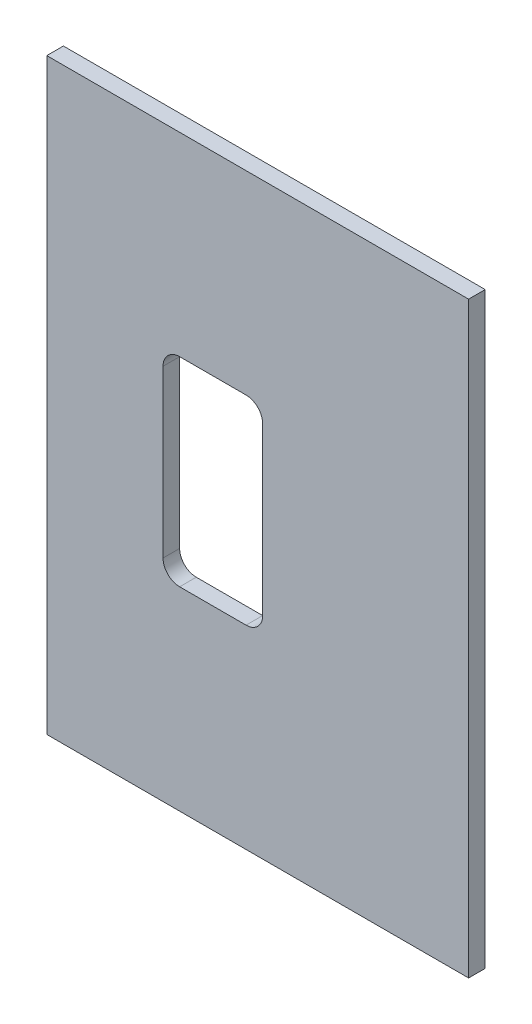
ISO-10303-21;
HEADER;
FILE_DESCRIPTION(('STEP AP214'),'2;1');
FILE_NAME('part.step','',(''),(''),'','','');
FILE_SCHEMA(('AUTOMOTIVE_DESIGN { 1 0 10303 214 1 1 1 1 }'));
ENDSEC;
DATA;
#1=APPLICATION_CONTEXT('core data for automotive mechanical design processes');
#2=APPLICATION_PROTOCOL_DEFINITION('international standard','automotive_design',2000,#1);
#3=PRODUCT_CONTEXT('',#1,'mechanical');
#4=PRODUCT('Part','Part','',(#3));
#5=PRODUCT_RELATED_PRODUCT_CATEGORY('part','',(#4));
#6=PRODUCT_DEFINITION_FORMATION('','',#4);
#7=PRODUCT_DEFINITION_CONTEXT('part definition',#1,'design');
#8=PRODUCT_DEFINITION('design','',#6,#7);
#9=PRODUCT_DEFINITION_SHAPE('','',#8);
#10=(LENGTH_UNIT() NAMED_UNIT(*) SI_UNIT(.MILLI.,.METRE.));
#11=(NAMED_UNIT(*) PLANE_ANGLE_UNIT() SI_UNIT($,.RADIAN.));
#12=(NAMED_UNIT(*) SI_UNIT($,.STERADIAN.) SOLID_ANGLE_UNIT());
#13=UNCERTAINTY_MEASURE_WITH_UNIT(LENGTH_MEASURE(1.E-05),#10,'distance_accuracy_value','');
#14=(GEOMETRIC_REPRESENTATION_CONTEXT(3) GLOBAL_UNCERTAINTY_ASSIGNED_CONTEXT((#13)) GLOBAL_UNIT_ASSIGNED_CONTEXT((#10,
#11,#12)) REPRESENTATION_CONTEXT('',''));
#15=CARTESIAN_POINT('',(0.,0.,0.));
#16=DIRECTION('',(0.,0.,1.));
#17=DIRECTION('',(1.,0.,0.));
#18=AXIS2_PLACEMENT_3D('',#15,#16,#17);
#19=CARTESIAN_POINT('',(40.3225,56.1975,3.175));
#20=DIRECTION('',(0.,0.,-1.));
#21=DIRECTION('',(-1.,0.,0.));
#22=AXIS2_PLACEMENT_3D('',#19,#20,#21);
#23=PLANE('',#22);
#24=DIRECTION('',(0.,1.,0.));
#25=VECTOR('',#24,1.);
#26=CARTESIAN_POINT('',(40.3225,-56.1975,3.175));
#27=LINE('',#26,#25);
#28=CARTESIAN_POINT('',(40.3225,-56.1975,3.175));
#29=VERTEX_POINT('',#28);
#30=CARTESIAN_POINT('',(40.3225,56.1975,3.175));
#31=VERTEX_POINT('',#30);
#32=EDGE_CURVE('E133',#29,#31,#27,.T.);
#33=ORIENTED_EDGE('',*,*,#32,.T.);
#34=DIRECTION('',(-1.,0.,0.));
#35=VECTOR('',#34,1.);
#36=CARTESIAN_POINT('',(-40.3225,56.1975,3.175));
#37=LINE('',#36,#35);
#38=CARTESIAN_POINT('',(-40.3225,56.1975,3.175));
#39=VERTEX_POINT('',#38);
#40=EDGE_CURVE('E122',#31,#39,#37,.T.);
#41=ORIENTED_EDGE('',*,*,#40,.T.);
#42=DIRECTION('',(0.,-1.,0.));
#43=VECTOR('',#42,1.);
#44=CARTESIAN_POINT('',(-40.3225,-56.1975,3.175));
#45=LINE('',#44,#43);
#46=CARTESIAN_POINT('',(-40.3225,-56.1975,3.175));
#47=VERTEX_POINT('',#46);
#48=EDGE_CURVE('E132',#39,#47,#45,.T.);
#49=ORIENTED_EDGE('',*,*,#48,.T.);
#50=DIRECTION('',(1.,0.,0.));
#51=VECTOR('',#50,1.);
#52=CARTESIAN_POINT('',(-40.3225,-56.1975,3.175));
#53=LINE('',#52,#51);
#54=EDGE_CURVE('E137',#47,#29,#53,.T.);
#55=ORIENTED_EDGE('',*,*,#54,.T.);
#56=EDGE_LOOP('',(#33,#41,#49,#55));
#57=FACE_BOUND('',#56,.T.);
#58=DIRECTION('',(1.,0.,0.));
#59=VECTOR('',#58,1.);
#60=CARTESIAN_POINT('',(-18.0975,-19.05,3.175));
#61=LINE('',#60,#59);
#62=CARTESIAN_POINT('',(-14.9224999999999,-19.05,3.175));
#63=VERTEX_POINT('',#62);
#64=CARTESIAN_POINT('',(-2.22249999999994,-19.05,3.175));
#65=VERTEX_POINT('',#64);
#66=EDGE_CURVE('E195',#63,#65,#61,.T.);
#67=ORIENTED_EDGE('',*,*,#66,.F.);
#68=CARTESIAN_POINT('',(-14.9224999999999,-15.875,3.175));
#69=DIRECTION('',(0.,0.,-1.));
#70=DIRECTION('',(-1.,0.,0.));
#71=AXIS2_PLACEMENT_3D('',#68,#69,#70);
#72=CIRCLE('',#71,3.175);
#73=CARTESIAN_POINT('',(-18.0975,-15.875,3.175));
#74=VERTEX_POINT('',#73);
#75=EDGE_CURVE('E172',#63,#74,#72,.T.);
#76=ORIENTED_EDGE('',*,*,#75,.T.);
#77=DIRECTION('',(0.,-1.,0.));
#78=VECTOR('',#77,1.);
#79=CARTESIAN_POINT('',(-18.0975,-19.05,3.175));
#80=LINE('',#79,#78);
#81=CARTESIAN_POINT('',(-18.0975,15.875,3.175));
#82=VERTEX_POINT('',#81);
#83=EDGE_CURVE('E200',#82,#74,#80,.T.);
#84=ORIENTED_EDGE('',*,*,#83,.F.);
#85=CARTESIAN_POINT('',(-14.9224999999999,15.875,3.175));
#86=DIRECTION('',(0.,0.,-1.));
#87=DIRECTION('',(-1.,0.,0.));
#88=AXIS2_PLACEMENT_3D('',#85,#86,#87);
#89=CIRCLE('',#88,3.175);
#90=CARTESIAN_POINT('',(-14.9224999999999,19.05,3.175));
#91=VERTEX_POINT('',#90);
#92=EDGE_CURVE('E11',#82,#91,#89,.T.);
#93=ORIENTED_EDGE('',*,*,#92,.T.);
#94=DIRECTION('',(-1.,0.,0.));
#95=VECTOR('',#94,1.);
#96=CARTESIAN_POINT('',(-18.0975,19.05,3.175));
#97=LINE('',#96,#95);
#98=CARTESIAN_POINT('',(-2.22249999999994,19.05,3.175));
#99=VERTEX_POINT('',#98);
#100=EDGE_CURVE('E198',#99,#91,#97,.T.);
#101=ORIENTED_EDGE('',*,*,#100,.F.);
#102=CARTESIAN_POINT('',(-2.22249999999994,15.875,3.175));
#103=DIRECTION('',(0.,0.,-1.));
#104=DIRECTION('',(-1.,0.,0.));
#105=AXIS2_PLACEMENT_3D('',#102,#103,#104);
#106=CIRCLE('',#105,3.175);
#107=CARTESIAN_POINT('',(0.952500000000057,15.875,3.175));
#108=VERTEX_POINT('',#107);
#109=EDGE_CURVE('E180',#99,#108,#106,.T.);
#110=ORIENTED_EDGE('',*,*,#109,.T.);
#111=DIRECTION('',(0.,1.,0.));
#112=VECTOR('',#111,1.);
#113=CARTESIAN_POINT('',(0.952500000000057,19.05,3.175));
#114=LINE('',#113,#112);
#115=CARTESIAN_POINT('',(0.952500000000057,-15.875,3.175));
#116=VERTEX_POINT('',#115);
#117=EDGE_CURVE('E201',#116,#108,#114,.T.);
#118=ORIENTED_EDGE('',*,*,#117,.F.);
#119=CARTESIAN_POINT('',(-2.22249999999994,-15.875,3.175));
#120=DIRECTION('',(0.,0.,-1.));
#121=DIRECTION('',(-1.,0.,0.));
#122=AXIS2_PLACEMENT_3D('',#119,#120,#121);
#123=CIRCLE('',#122,3.175);
#124=EDGE_CURVE('E176',#116,#65,#123,.T.);
#125=ORIENTED_EDGE('',*,*,#124,.T.);
#126=EDGE_LOOP('',(#67,#76,#84,#93,#101,#110,#118,#125));
#127=FACE_BOUND('',#126,.T.);
#128=ADVANCED_FACE('F33',(#57,#127),#23,.F.);
#129=CARTESIAN_POINT('',(40.3225,56.1975,0.));
#130=DIRECTION('',(0.,0.,-1.));
#131=DIRECTION('',(-1.,0.,0.));
#132=AXIS2_PLACEMENT_3D('',#129,#130,#131);
#133=PLANE('',#132);
#134=DIRECTION('',(0.,1.,0.));
#135=VECTOR('',#134,1.);
#136=CARTESIAN_POINT('',(40.3225,-56.1975,0.));
#137=LINE('',#136,#135);
#138=CARTESIAN_POINT('',(40.3225,-56.1975,0.));
#139=VERTEX_POINT('',#138);
#140=CARTESIAN_POINT('',(40.3225,56.1975,0.));
#141=VERTEX_POINT('',#140);
#142=EDGE_CURVE('E145',#139,#141,#137,.T.);
#143=ORIENTED_EDGE('',*,*,#142,.F.);
#144=DIRECTION('',(1.,0.,0.));
#145=VECTOR('',#144,1.);
#146=CARTESIAN_POINT('',(-40.3225,-56.1975,0.));
#147=LINE('',#146,#145);
#148=CARTESIAN_POINT('',(-40.3225,-56.1975,0.));
#149=VERTEX_POINT('',#148);
#150=EDGE_CURVE('E141',#149,#139,#147,.T.);
#151=ORIENTED_EDGE('',*,*,#150,.F.);
#152=DIRECTION('',(0.,-1.,0.));
#153=VECTOR('',#152,1.);
#154=CARTESIAN_POINT('',(-40.3225,-56.1975,0.));
#155=LINE('',#154,#153);
#156=CARTESIAN_POINT('',(-40.3225,56.1975,0.));
#157=VERTEX_POINT('',#156);
#158=EDGE_CURVE('E221',#157,#149,#155,.T.);
#159=ORIENTED_EDGE('',*,*,#158,.F.);
#160=DIRECTION('',(-1.,0.,0.));
#161=VECTOR('',#160,1.);
#162=CARTESIAN_POINT('',(-40.3225,56.1975,0.));
#163=LINE('',#162,#161);
#164=EDGE_CURVE('E219',#141,#157,#163,.T.);
#165=ORIENTED_EDGE('',*,*,#164,.F.);
#166=EDGE_LOOP('',(#143,#151,#159,#165));
#167=FACE_BOUND('',#166,.T.);
#168=DIRECTION('',(-1.,0.,0.));
#169=VECTOR('',#168,1.);
#170=CARTESIAN_POINT('',(-18.0975,19.05,0.));
#171=LINE('',#170,#169);
#172=CARTESIAN_POINT('',(-2.22249999999994,19.05,0.));
#173=VERTEX_POINT('',#172);
#174=CARTESIAN_POINT('',(-14.9224999999999,19.05,0.));
#175=VERTEX_POINT('',#174);
#176=EDGE_CURVE('E187',#173,#175,#171,.T.);
#177=ORIENTED_EDGE('',*,*,#176,.T.);
#178=CARTESIAN_POINT('',(-14.9224999999999,15.875,0.));
#179=DIRECTION('',(0.,0.,-1.));
#180=DIRECTION('',(-1.,0.,0.));
#181=AXIS2_PLACEMENT_3D('',#178,#179,#180);
#182=CIRCLE('',#181,3.175);
#183=CARTESIAN_POINT('',(-18.0975,15.875,0.));
#184=VERTEX_POINT('',#183);
#185=EDGE_CURVE('E41',#175,#184,#182,.F.);
#186=ORIENTED_EDGE('',*,*,#185,.T.);
#187=DIRECTION('',(0.,-1.,0.));
#188=VECTOR('',#187,1.);
#189=CARTESIAN_POINT('',(-18.0975,-19.05,0.));
#190=LINE('',#189,#188);
#191=CARTESIAN_POINT('',(-18.0975,-15.875,0.));
#192=VERTEX_POINT('',#191);
#193=EDGE_CURVE('E186',#184,#192,#190,.T.);
#194=ORIENTED_EDGE('',*,*,#193,.T.);
#195=CARTESIAN_POINT('',(-14.9224999999999,-15.875,0.));
#196=DIRECTION('',(0.,0.,-1.));
#197=DIRECTION('',(-1.,0.,0.));
#198=AXIS2_PLACEMENT_3D('',#195,#196,#197);
#199=CIRCLE('',#198,3.175);
#200=CARTESIAN_POINT('',(-14.9224999999999,-19.05,0.));
#201=VERTEX_POINT('',#200);
#202=EDGE_CURVE('E170',#192,#201,#199,.F.);
#203=ORIENTED_EDGE('',*,*,#202,.T.);
#204=DIRECTION('',(1.,0.,0.));
#205=VECTOR('',#204,1.);
#206=CARTESIAN_POINT('',(-18.0975,-19.05,0.));
#207=LINE('',#206,#205);
#208=CARTESIAN_POINT('',(-2.22249999999994,-19.05,0.));
#209=VERTEX_POINT('',#208);
#210=EDGE_CURVE('E208',#201,#209,#207,.T.);
#211=ORIENTED_EDGE('',*,*,#210,.T.);
#212=CARTESIAN_POINT('',(-2.22249999999994,-15.875,0.));
#213=DIRECTION('',(0.,0.,-1.));
#214=DIRECTION('',(-1.,0.,0.));
#215=AXIS2_PLACEMENT_3D('',#212,#213,#214);
#216=CIRCLE('',#215,3.175);
#217=CARTESIAN_POINT('',(0.952500000000057,-15.875,0.));
#218=VERTEX_POINT('',#217);
#219=EDGE_CURVE('E174',#209,#218,#216,.F.);
#220=ORIENTED_EDGE('',*,*,#219,.T.);
#221=DIRECTION('',(0.,1.,0.));
#222=VECTOR('',#221,1.);
#223=CARTESIAN_POINT('',(0.952500000000057,19.05,0.));
#224=LINE('',#223,#222);
#225=CARTESIAN_POINT('',(0.952500000000057,15.875,0.));
#226=VERTEX_POINT('',#225);
#227=EDGE_CURVE('E211',#218,#226,#224,.T.);
#228=ORIENTED_EDGE('',*,*,#227,.T.);
#229=CARTESIAN_POINT('',(-2.22249999999994,15.875,0.));
#230=DIRECTION('',(0.,0.,-1.));
#231=DIRECTION('',(-1.,0.,0.));
#232=AXIS2_PLACEMENT_3D('',#229,#230,#231);
#233=CIRCLE('',#232,3.175);
#234=EDGE_CURVE('E178',#226,#173,#233,.F.);
#235=ORIENTED_EDGE('',*,*,#234,.T.);
#236=EDGE_LOOP('',(#177,#186,#194,#203,#211,#220,#228,#235));
#237=FACE_BOUND('',#236,.T.);
#238=ADVANCED_FACE('F185',(#167,#237),#133,.T.);
#239=CARTESIAN_POINT('',(40.3225,-56.1975,3.175));
#240=DIRECTION('',(-1.,0.,0.));
#241=DIRECTION('',(0.,0.,1.));
#242=AXIS2_PLACEMENT_3D('',#239,#240,#241);
#243=PLANE('',#242);
#244=ORIENTED_EDGE('',*,*,#142,.T.);
#245=DIRECTION('',(0.,0.,-1.));
#246=VECTOR('',#245,1.);
#247=CARTESIAN_POINT('',(40.3225,56.1975,3.175));
#248=LINE('',#247,#246);
#249=EDGE_CURVE('E126',#31,#141,#248,.T.);
#250=ORIENTED_EDGE('',*,*,#249,.F.);
#251=ORIENTED_EDGE('',*,*,#32,.F.);
#252=DIRECTION('',(0.,0.,-1.));
#253=VECTOR('',#252,1.);
#254=CARTESIAN_POINT('',(40.3225,-56.1975,3.175));
#255=LINE('',#254,#253);
#256=EDGE_CURVE('E217',#29,#139,#255,.T.);
#257=ORIENTED_EDGE('',*,*,#256,.T.);
#258=EDGE_LOOP('',(#244,#250,#251,#257));
#259=FACE_BOUND('',#258,.T.);
#260=ADVANCED_FACE('F143',(#259),#243,.F.);
#261=CARTESIAN_POINT('',(-40.3225,56.1975,3.175));
#262=DIRECTION('',(0.,-1.,0.));
#263=DIRECTION('',(0.,0.,-1.));
#264=AXIS2_PLACEMENT_3D('',#261,#262,#263);
#265=PLANE('',#264);
#266=ORIENTED_EDGE('',*,*,#164,.T.);
#267=DIRECTION('',(0.,0.,-1.));
#268=VECTOR('',#267,1.);
#269=CARTESIAN_POINT('',(-40.3225,56.1975,3.175));
#270=LINE('',#269,#268);
#271=EDGE_CURVE('E129',#39,#157,#270,.T.);
#272=ORIENTED_EDGE('',*,*,#271,.F.);
#273=ORIENTED_EDGE('',*,*,#40,.F.);
#274=ORIENTED_EDGE('',*,*,#249,.T.);
#275=EDGE_LOOP('',(#266,#272,#273,#274));
#276=FACE_BOUND('',#275,.T.);
#277=ADVANCED_FACE('F124',(#276),#265,.F.);
#278=CARTESIAN_POINT('',(-40.3225,-56.1975,3.175));
#279=DIRECTION('',(1.,0.,0.));
#280=DIRECTION('',(0.,0.,-1.));
#281=AXIS2_PLACEMENT_3D('',#278,#279,#280);
#282=PLANE('',#281);
#283=ORIENTED_EDGE('',*,*,#158,.T.);
#284=DIRECTION('',(0.,0.,-1.));
#285=VECTOR('',#284,1.);
#286=CARTESIAN_POINT('',(-40.3225,-56.1975,3.175));
#287=LINE('',#286,#285);
#288=EDGE_CURVE('E150',#47,#149,#287,.T.);
#289=ORIENTED_EDGE('',*,*,#288,.F.);
#290=ORIENTED_EDGE('',*,*,#48,.F.);
#291=ORIENTED_EDGE('',*,*,#271,.T.);
#292=EDGE_LOOP('',(#283,#289,#290,#291));
#293=FACE_BOUND('',#292,.T.);
#294=ADVANCED_FACE('F232',(#293),#282,.F.);
#295=CARTESIAN_POINT('',(-40.3225,-56.1975,3.175));
#296=DIRECTION('',(0.,1.,0.));
#297=DIRECTION('',(0.,0.,1.));
#298=AXIS2_PLACEMENT_3D('',#295,#296,#297);
#299=PLANE('',#298);
#300=ORIENTED_EDGE('',*,*,#150,.T.);
#301=ORIENTED_EDGE('',*,*,#256,.F.);
#302=ORIENTED_EDGE('',*,*,#54,.F.);
#303=ORIENTED_EDGE('',*,*,#288,.T.);
#304=EDGE_LOOP('',(#300,#301,#302,#303));
#305=FACE_BOUND('',#304,.T.);
#306=ADVANCED_FACE('F228',(#305),#299,.F.);
#307=CARTESIAN_POINT('',(-18.0975,-19.05,3.175));
#308=DIRECTION('',(0.,1.,0.));
#309=DIRECTION('',(0.,0.,1.));
#310=AXIS2_PLACEMENT_3D('',#307,#308,#309);
#311=PLANE('',#310);
#312=ORIENTED_EDGE('',*,*,#210,.F.);
#313=DIRECTION('',(0.,0.,-1.));
#314=VECTOR('',#313,1.);
#315=CARTESIAN_POINT('',(-14.9224999999999,-19.05,3.175));
#316=LINE('',#315,#314);
#317=EDGE_CURVE('E159',#201,#63,#316,.F.);
#318=ORIENTED_EDGE('',*,*,#317,.T.);
#319=ORIENTED_EDGE('',*,*,#66,.T.);
#320=DIRECTION('',(0.,0.,-1.));
#321=VECTOR('',#320,1.);
#322=CARTESIAN_POINT('',(-2.22249999999994,-19.05,0.));
#323=LINE('',#322,#321);
#324=EDGE_CURVE('E156',#65,#209,#323,.T.);
#325=ORIENTED_EDGE('',*,*,#324,.T.);
#326=EDGE_LOOP('',(#312,#318,#319,#325));
#327=FACE_BOUND('',#326,.T.);
#328=ADVANCED_FACE('F239',(#327),#311,.T.);
#329=CARTESIAN_POINT('',(0.952500000000057,19.05,3.175));
#330=DIRECTION('',(-1.,0.,0.));
#331=DIRECTION('',(0.,0.,1.));
#332=AXIS2_PLACEMENT_3D('',#329,#330,#331);
#333=PLANE('',#332);
#334=ORIENTED_EDGE('',*,*,#227,.F.);
#335=DIRECTION('',(0.,0.,-1.));
#336=VECTOR('',#335,1.);
#337=CARTESIAN_POINT('',(0.952500000000057,-15.875,3.175));
#338=LINE('',#337,#336);
#339=EDGE_CURVE('E164',#218,#116,#338,.F.);
#340=ORIENTED_EDGE('',*,*,#339,.T.);
#341=ORIENTED_EDGE('',*,*,#117,.T.);
#342=DIRECTION('',(0.,0.,-1.));
#343=VECTOR('',#342,1.);
#344=CARTESIAN_POINT('',(0.952500000000057,15.875,0.));
#345=LINE('',#344,#343);
#346=EDGE_CURVE('E161',#108,#226,#345,.T.);
#347=ORIENTED_EDGE('',*,*,#346,.T.);
#348=EDGE_LOOP('',(#334,#340,#341,#347));
#349=FACE_BOUND('',#348,.T.);
#350=ADVANCED_FACE('F251',(#349),#333,.T.);
#351=CARTESIAN_POINT('',(-18.0975,19.05,3.175));
#352=DIRECTION('',(0.,-1.,0.));
#353=DIRECTION('',(0.,0.,-1.));
#354=AXIS2_PLACEMENT_3D('',#351,#352,#353);
#355=PLANE('',#354);
#356=ORIENTED_EDGE('',*,*,#176,.F.);
#357=DIRECTION('',(0.,0.,-1.));
#358=VECTOR('',#357,1.);
#359=CARTESIAN_POINT('',(-2.22249999999994,19.05,3.175));
#360=LINE('',#359,#358);
#361=EDGE_CURVE('E53',#173,#99,#360,.F.);
#362=ORIENTED_EDGE('',*,*,#361,.T.);
#363=ORIENTED_EDGE('',*,*,#100,.T.);
#364=DIRECTION('',(0.,0.,-1.));
#365=VECTOR('',#364,1.);
#366=CARTESIAN_POINT('',(-14.9224999999999,19.05,0.));
#367=LINE('',#366,#365);
#368=EDGE_CURVE('E166',#91,#175,#367,.T.);
#369=ORIENTED_EDGE('',*,*,#368,.T.);
#370=EDGE_LOOP('',(#356,#362,#363,#369));
#371=FACE_BOUND('',#370,.T.);
#372=ADVANCED_FACE('F197',(#371),#355,.T.);
#373=CARTESIAN_POINT('',(-18.0975,-19.05,3.175));
#374=DIRECTION('',(1.,0.,0.));
#375=DIRECTION('',(0.,0.,-1.));
#376=AXIS2_PLACEMENT_3D('',#373,#374,#375);
#377=PLANE('',#376);
#378=ORIENTED_EDGE('',*,*,#83,.T.);
#379=DIRECTION('',(0.,0.,-1.));
#380=VECTOR('',#379,1.);
#381=CARTESIAN_POINT('',(-18.0975,-15.875,0.));
#382=LINE('',#381,#380);
#383=EDGE_CURVE('E148',#74,#192,#382,.T.);
#384=ORIENTED_EDGE('',*,*,#383,.T.);
#385=ORIENTED_EDGE('',*,*,#193,.F.);
#386=DIRECTION('',(0.,0.,-1.));
#387=VECTOR('',#386,1.);
#388=CARTESIAN_POINT('',(-18.0975,15.875,3.175));
#389=LINE('',#388,#387);
#390=EDGE_CURVE('E146',#184,#82,#389,.F.);
#391=ORIENTED_EDGE('',*,*,#390,.T.);
#392=EDGE_LOOP('',(#378,#384,#385,#391));
#393=FACE_BOUND('',#392,.T.);
#394=ADVANCED_FACE('F193',(#393),#377,.T.);
#395=CARTESIAN_POINT('',(-14.9224999999999,-15.875,3.175));
#396=DIRECTION('',(0.,0.,1.));
#397=DIRECTION('',(1.,0.,0.));
#398=AXIS2_PLACEMENT_3D('',#395,#396,#397);
#399=CYLINDRICAL_SURFACE('',#398,3.175);
#400=ORIENTED_EDGE('',*,*,#75,.F.);
#401=ORIENTED_EDGE('',*,*,#317,.F.);
#402=ORIENTED_EDGE('',*,*,#202,.F.);
#403=ORIENTED_EDGE('',*,*,#383,.F.);
#404=EDGE_LOOP('',(#400,#401,#402,#403));
#405=FACE_BOUND('',#404,.T.);
#406=ADVANCED_FACE('F259',(#405),#399,.F.);
#407=CARTESIAN_POINT('',(-2.22249999999994,-15.875,3.175));
#408=DIRECTION('',(0.,0.,1.));
#409=DIRECTION('',(1.,0.,0.));
#410=AXIS2_PLACEMENT_3D('',#407,#408,#409);
#411=CYLINDRICAL_SURFACE('',#410,3.175);
#412=ORIENTED_EDGE('',*,*,#124,.F.);
#413=ORIENTED_EDGE('',*,*,#339,.F.);
#414=ORIENTED_EDGE('',*,*,#219,.F.);
#415=ORIENTED_EDGE('',*,*,#324,.F.);
#416=EDGE_LOOP('',(#412,#413,#414,#415));
#417=FACE_BOUND('',#416,.T.);
#418=ADVANCED_FACE('F263',(#417),#411,.F.);
#419=CARTESIAN_POINT('',(-2.22249999999994,15.875,3.175));
#420=DIRECTION('',(0.,0.,1.));
#421=DIRECTION('',(1.,0.,0.));
#422=AXIS2_PLACEMENT_3D('',#419,#420,#421);
#423=CYLINDRICAL_SURFACE('',#422,3.175);
#424=ORIENTED_EDGE('',*,*,#109,.F.);
#425=ORIENTED_EDGE('',*,*,#361,.F.);
#426=ORIENTED_EDGE('',*,*,#234,.F.);
#427=ORIENTED_EDGE('',*,*,#346,.F.);
#428=EDGE_LOOP('',(#424,#425,#426,#427));
#429=FACE_BOUND('',#428,.T.);
#430=ADVANCED_FACE('F269',(#429),#423,.F.);
#431=CARTESIAN_POINT('',(-14.9224999999999,15.875,3.175));
#432=DIRECTION('',(0.,0.,1.));
#433=DIRECTION('',(1.,0.,0.));
#434=AXIS2_PLACEMENT_3D('',#431,#432,#433);
#435=CYLINDRICAL_SURFACE('',#434,3.175);
#436=ORIENTED_EDGE('',*,*,#92,.F.);
#437=ORIENTED_EDGE('',*,*,#390,.F.);
#438=ORIENTED_EDGE('',*,*,#185,.F.);
#439=ORIENTED_EDGE('',*,*,#368,.F.);
#440=EDGE_LOOP('',(#436,#437,#438,#439));
#441=FACE_BOUND('',#440,.T.);
#442=ADVANCED_FACE('F35',(#441),#435,.F.);
#443=CLOSED_SHELL('',(#128,#238,#260,#277,#294,#306,#328,#350,#372,#394,#406,#418,#430,#442));
#444=MANIFOLD_SOLID_BREP('B2',#443);
#445=ADVANCED_BREP_SHAPE_REPRESENTATION('',(#18,#444),#14);
#446=SHAPE_DEFINITION_REPRESENTATION(#9,#445);
ENDSEC;
END-ISO-10303-21;
